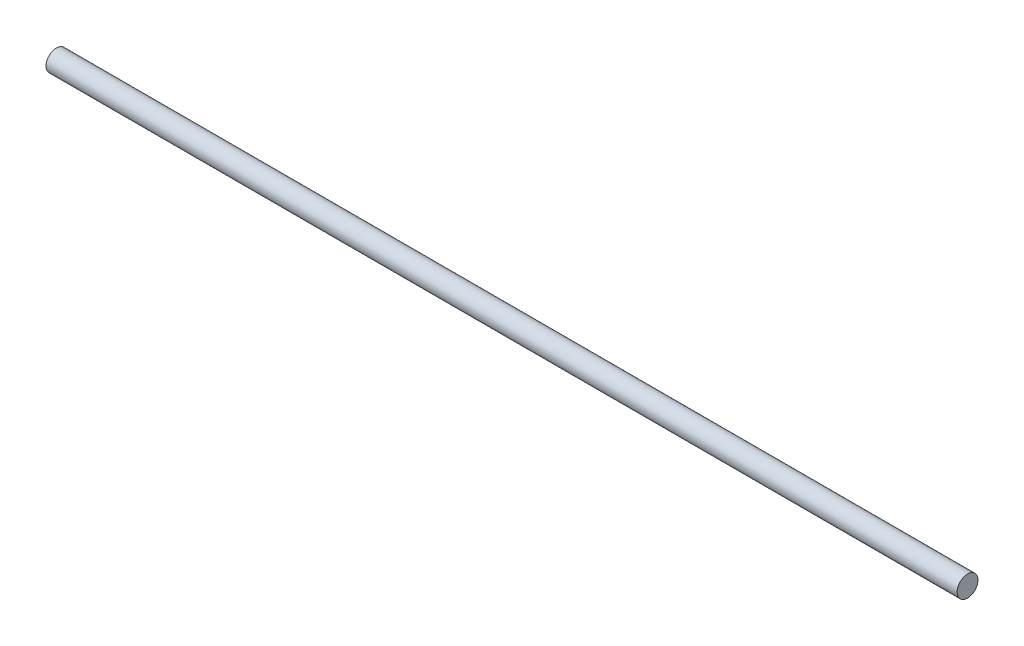
ISO-10303-21;
HEADER;
FILE_DESCRIPTION(('STEP AP214'),'2;1');
FILE_NAME('part.step','',(''),(''),'','','');
FILE_SCHEMA(('AUTOMOTIVE_DESIGN { 1 0 10303 214 1 1 1 1 }'));
ENDSEC;
DATA;
#1=APPLICATION_CONTEXT('core data for automotive mechanical design processes');
#2=APPLICATION_PROTOCOL_DEFINITION('international standard','automotive_design',2000,#1);
#3=PRODUCT_CONTEXT('',#1,'mechanical');
#4=PRODUCT('Part','Part','',(#3));
#5=PRODUCT_RELATED_PRODUCT_CATEGORY('part','',(#4));
#6=PRODUCT_DEFINITION_FORMATION('','',#4);
#7=PRODUCT_DEFINITION_CONTEXT('part definition',#1,'design');
#8=PRODUCT_DEFINITION('design','',#6,#7);
#9=PRODUCT_DEFINITION_SHAPE('','',#8);
#10=(LENGTH_UNIT() NAMED_UNIT(*) SI_UNIT(.MILLI.,.METRE.));
#11=(NAMED_UNIT(*) PLANE_ANGLE_UNIT() SI_UNIT($,.RADIAN.));
#12=(NAMED_UNIT(*) SI_UNIT($,.STERADIAN.) SOLID_ANGLE_UNIT());
#13=UNCERTAINTY_MEASURE_WITH_UNIT(LENGTH_MEASURE(1.E-05),#10,'distance_accuracy_value','');
#14=(GEOMETRIC_REPRESENTATION_CONTEXT(3) GLOBAL_UNCERTAINTY_ASSIGNED_CONTEXT((#13)) GLOBAL_UNIT_ASSIGNED_CONTEXT((#10,
#11,#12)) REPRESENTATION_CONTEXT('',''));
#15=CARTESIAN_POINT('',(0.,0.,0.));
#16=DIRECTION('',(0.,0.,1.));
#17=DIRECTION('',(1.,0.,0.));
#18=AXIS2_PLACEMENT_3D('',#15,#16,#17);
#19=CARTESIAN_POINT('',(-416.075,0.,0.));
#20=DIRECTION('',(1.,0.,0.));
#21=DIRECTION('',(0.,0.,-1.));
#22=AXIS2_PLACEMENT_3D('',#19,#20,#21);
#23=PLANE('',#22);
#24=CARTESIAN_POINT('',(-416.075,0.,0.));
#25=DIRECTION('',(1.,0.,0.));
#26=DIRECTION('',(0.,0.,-1.));
#27=AXIS2_PLACEMENT_3D('',#24,#25,#26);
#28=CIRCLE('',#27,9.525);
#29=CARTESIAN_POINT('',(-416.075,0.,-9.525));
#30=VERTEX_POINT('',#29);
#31=EDGE_CURVE('E38',#30,#30,#28,.T.);
#32=ORIENTED_EDGE('',*,*,#31,.F.);
#33=EDGE_LOOP('',(#32));
#34=FACE_BOUND('',#33,.T.);
#35=ADVANCED_FACE('F31',(#34),#23,.F.);
#36=CARTESIAN_POINT('',(415.925,0.,0.));
#37=DIRECTION('',(1.,0.,0.));
#38=DIRECTION('',(0.,0.,-1.));
#39=AXIS2_PLACEMENT_3D('',#36,#37,#38);
#40=PLANE('',#39);
#41=CARTESIAN_POINT('',(415.925,0.,0.));
#42=DIRECTION('',(1.,0.,0.));
#43=DIRECTION('',(0.,0.,-1.));
#44=AXIS2_PLACEMENT_3D('',#41,#42,#43);
#45=CIRCLE('',#44,9.525);
#46=CARTESIAN_POINT('',(415.925,0.,-9.525));
#47=VERTEX_POINT('',#46);
#48=EDGE_CURVE('E10',#47,#47,#45,.F.);
#49=ORIENTED_EDGE('',*,*,#48,.F.);
#50=EDGE_LOOP('',(#49));
#51=FACE_BOUND('',#50,.T.);
#52=ADVANCED_FACE('F33',(#51),#40,.T.);
#53=CARTESIAN_POINT('',(-415.925,0.,0.));
#54=DIRECTION('',(1.,0.,0.));
#55=DIRECTION('',(0.,0.,-1.));
#56=AXIS2_PLACEMENT_3D('',#53,#54,#55);
#57=CYLINDRICAL_SURFACE('',#56,9.525);
#58=ORIENTED_EDGE('',*,*,#48,.T.);
#59=EDGE_LOOP('',(#58));
#60=FACE_BOUND('',#59,.T.);
#61=ORIENTED_EDGE('',*,*,#31,.T.);
#62=EDGE_LOOP('',(#61));
#63=FACE_BOUND('',#62,.T.);
#64=ADVANCED_FACE('F44',(#60,#63),#57,.T.);
#65=CLOSED_SHELL('',(#35,#52,#64));
#66=MANIFOLD_SOLID_BREP('B2',#65);
#67=ADVANCED_BREP_SHAPE_REPRESENTATION('',(#18,#66),#14);
#68=SHAPE_DEFINITION_REPRESENTATION(#9,#67);
ENDSEC;
END-ISO-10303-21;
